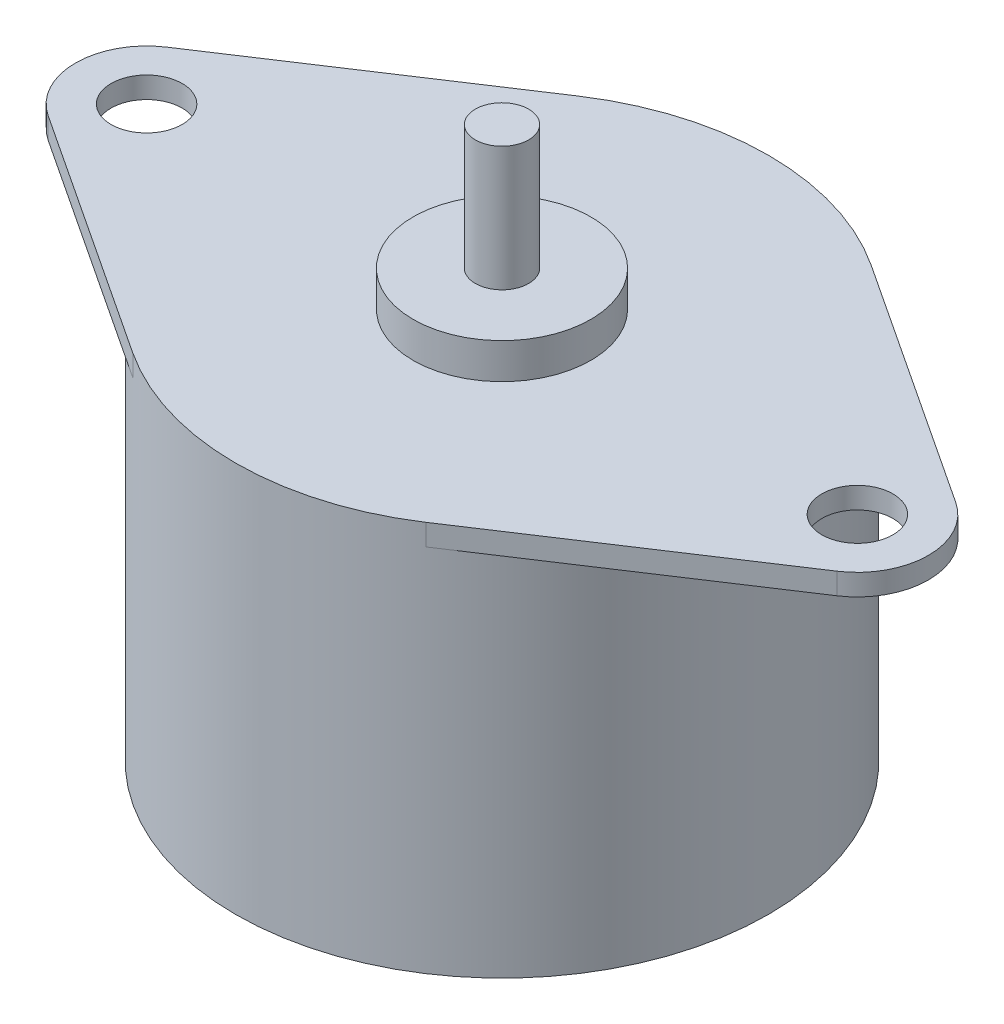
ISO-10303-21;
HEADER;
FILE_DESCRIPTION(('STEP AP214'),'2;1');
FILE_NAME('part.step','',(''),(''),'','','');
FILE_SCHEMA(('AUTOMOTIVE_DESIGN { 1 0 10303 214 1 1 1 1 }'));
ENDSEC;
DATA;
#1=APPLICATION_CONTEXT('core data for automotive mechanical design processes');
#2=APPLICATION_PROTOCOL_DEFINITION('international standard','automotive_design',2000,#1);
#3=PRODUCT_CONTEXT('',#1,'mechanical');
#4=PRODUCT('Part','Part','',(#3));
#5=PRODUCT_RELATED_PRODUCT_CATEGORY('part','',(#4));
#6=PRODUCT_DEFINITION_FORMATION('','',#4);
#7=PRODUCT_DEFINITION_CONTEXT('part definition',#1,'design');
#8=PRODUCT_DEFINITION('design','',#6,#7);
#9=PRODUCT_DEFINITION_SHAPE('','',#8);
#10=(LENGTH_UNIT() NAMED_UNIT(*) SI_UNIT(.MILLI.,.METRE.));
#11=(NAMED_UNIT(*) PLANE_ANGLE_UNIT() SI_UNIT($,.RADIAN.));
#12=(NAMED_UNIT(*) SI_UNIT($,.STERADIAN.) SOLID_ANGLE_UNIT());
#13=UNCERTAINTY_MEASURE_WITH_UNIT(LENGTH_MEASURE(1.E-05),#10,'distance_accuracy_value','');
#14=(GEOMETRIC_REPRESENTATION_CONTEXT(3) GLOBAL_UNCERTAINTY_ASSIGNED_CONTEXT((#13)) GLOBAL_UNIT_ASSIGNED_CONTEXT((#10,
#11,#12)) REPRESENTATION_CONTEXT('',''));
#15=CARTESIAN_POINT('',(0.,0.,0.));
#16=DIRECTION('',(0.,0.,1.));
#17=DIRECTION('',(1.,0.,0.));
#18=AXIS2_PLACEMENT_3D('',#15,#16,#17);
#19=CARTESIAN_POINT('',(0.,-1.,0.));
#20=DIRECTION('',(0.,-1.,0.));
#21=DIRECTION('',(0.,0.,-1.));
#22=AXIS2_PLACEMENT_3D('',#19,#20,#21);
#23=PLANE('',#22);
#24=CARTESIAN_POINT('',(0.,-1.,0.));
#25=DIRECTION('',(0.,-1.,0.));
#26=DIRECTION('',(0.,0.,-1.));
#27=AXIS2_PLACEMENT_3D('',#24,#25,#26);
#28=CIRCLE('',#27,3.);
#29=CARTESIAN_POINT('',(0.,-1.,-3.));
#30=VERTEX_POINT('',#29);
#31=EDGE_CURVE('E127',#30,#30,#28,.T.);
#32=ORIENTED_EDGE('',*,*,#31,.T.);
#33=EDGE_LOOP('',(#32));
#34=FACE_BOUND('',#33,.T.);
#35=CARTESIAN_POINT('',(0.,-1.,0.));
#36=DIRECTION('',(0.,-1.,0.));
#37=DIRECTION('',(0.,0.,-1.));
#38=AXIS2_PLACEMENT_3D('',#35,#36,#37);
#39=CIRCLE('',#38,0.75);
#40=CARTESIAN_POINT('',(0.,-1.,-0.75));
#41=VERTEX_POINT('',#40);
#42=EDGE_CURVE('E222',#41,#41,#39,.T.);
#43=ORIENTED_EDGE('',*,*,#42,.F.);
#44=EDGE_LOOP('',(#43));
#45=FACE_BOUND('',#44,.T.);
#46=ADVANCED_FACE('F35',(#34,#45),#23,.T.);
#47=CARTESIAN_POINT('',(0.,12.,0.));
#48=DIRECTION('',(0.,1.,0.));
#49=DIRECTION('',(0.,0.,1.));
#50=AXIS2_PLACEMENT_3D('',#47,#48,#49);
#51=PLANE('',#50);
#52=CARTESIAN_POINT('',(0.,12.,0.));
#53=DIRECTION('',(0.,1.,0.));
#54=DIRECTION('',(0.,0.,1.));
#55=AXIS2_PLACEMENT_3D('',#52,#53,#54);
#56=CIRCLE('',#55,2.5);
#57=CARTESIAN_POINT('',(0.,12.,2.5));
#58=VERTEX_POINT('',#57);
#59=EDGE_CURVE('E207',#58,#58,#56,.T.);
#60=ORIENTED_EDGE('',*,*,#59,.T.);
#61=EDGE_LOOP('',(#60));
#62=FACE_BOUND('',#61,.T.);
#63=CARTESIAN_POINT('',(0.,12.,0.));
#64=DIRECTION('',(0.,1.,0.));
#65=DIRECTION('',(0.,0.,1.));
#66=AXIS2_PLACEMENT_3D('',#63,#64,#65);
#67=CIRCLE('',#66,0.75);
#68=CARTESIAN_POINT('',(0.,12.,0.75));
#69=VERTEX_POINT('',#68);
#70=EDGE_CURVE('E216',#69,#69,#67,.T.);
#71=ORIENTED_EDGE('',*,*,#70,.F.);
#72=EDGE_LOOP('',(#71));
#73=FACE_BOUND('',#72,.T.);
#74=ADVANCED_FACE('F238',(#62,#73),#51,.T.);
#75=CARTESIAN_POINT('',(-10.,11.,0.));
#76=DIRECTION('',(0.,1.,0.));
#77=DIRECTION('',(0.,0.,1.));
#78=AXIS2_PLACEMENT_3D('',#75,#76,#77);
#79=PLANE('',#78);
#80=CARTESIAN_POINT('',(10.,11.,0.));
#81=DIRECTION('',(0.,1.,0.));
#82=DIRECTION('',(0.,0.,1.));
#83=AXIS2_PLACEMENT_3D('',#80,#81,#82);
#84=CIRCLE('',#83,1.);
#85=CARTESIAN_POINT('',(10.,11.,1.));
#86=VERTEX_POINT('',#85);
#87=EDGE_CURVE('E201',#86,#86,#84,.T.);
#88=ORIENTED_EDGE('',*,*,#87,.F.);
#89=EDGE_LOOP('',(#88));
#90=FACE_BOUND('',#89,.T.);
#91=CARTESIAN_POINT('',(-10.,11.,0.));
#92=DIRECTION('',(0.,1.,0.));
#93=DIRECTION('',(0.,0.,1.));
#94=AXIS2_PLACEMENT_3D('',#91,#92,#93);
#95=CIRCLE('',#94,2.);
#96=CARTESIAN_POINT('',(-11.1,11.,-1.67032930884901));
#97=VERTEX_POINT('',#96);
#98=CARTESIAN_POINT('',(-11.1,11.,1.67032930884901));
#99=VERTEX_POINT('',#98);
#100=EDGE_CURVE('E112',#97,#99,#95,.T.);
#101=ORIENTED_EDGE('',*,*,#100,.T.);
#102=DIRECTION('',(0.835164654424503,0.,0.549999999999999));
#103=VECTOR('',#102,1.);
#104=CARTESIAN_POINT('',(-11.1,11.,1.67032930884901));
#105=LINE('',#104,#103);
#106=CARTESIAN_POINT('',(-4.125,11.,6.26373490818378));
#107=VERTEX_POINT('',#106);
#108=EDGE_CURVE('E102',#99,#107,#105,.T.);
#109=ORIENTED_EDGE('',*,*,#108,.T.);
#110=CARTESIAN_POINT('',(0.,11.,0.));
#111=DIRECTION('',(0.,1.,0.));
#112=DIRECTION('',(0.,0.,-1.));
#113=AXIS2_PLACEMENT_3D('',#110,#111,#112);
#114=CIRCLE('',#113,7.49999999999997);
#115=CARTESIAN_POINT('',(4.12499999999999,11.,6.26373490818378));
#116=VERTEX_POINT('',#115);
#117=EDGE_CURVE('E111',#107,#116,#114,.T.);
#118=ORIENTED_EDGE('',*,*,#117,.T.);
#119=DIRECTION('',(0.835164654424503,0.,-0.55));
#120=VECTOR('',#119,1.);
#121=CARTESIAN_POINT('',(11.1,11.,1.67032930884901));
#122=LINE('',#121,#120);
#123=CARTESIAN_POINT('',(11.1,11.,1.670329308849));
#124=VERTEX_POINT('',#123);
#125=EDGE_CURVE('E195',#116,#124,#122,.T.);
#126=ORIENTED_EDGE('',*,*,#125,.T.);
#127=CARTESIAN_POINT('',(10.,11.,0.));
#128=DIRECTION('',(0.,1.,0.));
#129=DIRECTION('',(0.,0.,-1.));
#130=AXIS2_PLACEMENT_3D('',#127,#128,#129);
#131=CIRCLE('',#130,2.);
#132=CARTESIAN_POINT('',(11.1,11.,-1.670329308849));
#133=VERTEX_POINT('',#132);
#134=EDGE_CURVE('E193',#124,#133,#131,.T.);
#135=ORIENTED_EDGE('',*,*,#134,.T.);
#136=DIRECTION('',(-0.835164654424503,0.,-0.550000000000001));
#137=VECTOR('',#136,1.);
#138=CARTESIAN_POINT('',(4.125,11.,-6.26373490818377));
#139=LINE('',#138,#137);
#140=CARTESIAN_POINT('',(4.125,11.,-6.26373490818377));
#141=VERTEX_POINT('',#140);
#142=EDGE_CURVE('E191',#133,#141,#139,.T.);
#143=ORIENTED_EDGE('',*,*,#142,.T.);
#144=CARTESIAN_POINT('',(0.,11.,0.));
#145=DIRECTION('',(0.,1.,0.));
#146=DIRECTION('',(0.,0.,-1.));
#147=AXIS2_PLACEMENT_3D('',#144,#145,#146);
#148=CIRCLE('',#147,7.5);
#149=CARTESIAN_POINT('',(-4.125,11.,-6.26373490818378));
#150=VERTEX_POINT('',#149);
#151=EDGE_CURVE('E189',#141,#150,#148,.T.);
#152=ORIENTED_EDGE('',*,*,#151,.T.);
#153=DIRECTION('',(-0.835164654424503,0.,0.55));
#154=VECTOR('',#153,1.);
#155=CARTESIAN_POINT('',(-11.1,11.,-1.67032930884901));
#156=LINE('',#155,#154);
#157=EDGE_CURVE('E118',#150,#97,#156,.T.);
#158=ORIENTED_EDGE('',*,*,#157,.T.);
#159=EDGE_LOOP('',(#101,#109,#118,#126,#135,#143,#152,#158));
#160=FACE_BOUND('',#159,.T.);
#161=CARTESIAN_POINT('',(-10.,11.,0.));
#162=DIRECTION('',(0.,1.,0.));
#163=DIRECTION('',(0.,0.,1.));
#164=AXIS2_PLACEMENT_3D('',#161,#162,#163);
#165=CIRCLE('',#164,1.);
#166=CARTESIAN_POINT('',(-10.,11.,1.));
#167=VERTEX_POINT('',#166);
#168=EDGE_CURVE('E187',#167,#167,#165,.T.);
#169=ORIENTED_EDGE('',*,*,#168,.F.);
#170=EDGE_LOOP('',(#169));
#171=FACE_BOUND('',#170,.T.);
#172=CARTESIAN_POINT('',(0.,11.,0.));
#173=DIRECTION('',(0.,1.,0.));
#174=DIRECTION('',(0.,0.,1.));
#175=AXIS2_PLACEMENT_3D('',#172,#173,#174);
#176=CIRCLE('',#175,2.5);
#177=CARTESIAN_POINT('',(0.,11.,2.5));
#178=VERTEX_POINT('',#177);
#179=EDGE_CURVE('E210',#178,#178,#176,.T.);
#180=ORIENTED_EDGE('',*,*,#179,.F.);
#181=EDGE_LOOP('',(#180));
#182=FACE_BOUND('',#181,.T.);
#183=ADVANCED_FACE('F115',(#90,#160,#171,#182),#79,.T.);
#184=CARTESIAN_POINT('',(0.,0.,0.));
#185=DIRECTION('',(0.,1.,0.));
#186=DIRECTION('',(0.,0.,1.));
#187=AXIS2_PLACEMENT_3D('',#184,#185,#186);
#188=PLANE('',#187);
#189=CARTESIAN_POINT('',(0.,0.,0.));
#190=DIRECTION('',(0.,1.,0.));
#191=DIRECTION('',(0.,0.,1.));
#192=AXIS2_PLACEMENT_3D('',#189,#190,#191);
#193=CIRCLE('',#192,7.5);
#194=CARTESIAN_POINT('',(0.,0.,7.5));
#195=VERTEX_POINT('',#194);
#196=EDGE_CURVE('E130',#195,#195,#193,.T.);
#197=ORIENTED_EDGE('',*,*,#196,.F.);
#198=EDGE_LOOP('',(#197));
#199=FACE_BOUND('',#198,.T.);
#200=CARTESIAN_POINT('',(0.,0.,0.));
#201=DIRECTION('',(0.,1.,0.));
#202=DIRECTION('',(0.,0.,1.));
#203=AXIS2_PLACEMENT_3D('',#200,#201,#202);
#204=CIRCLE('',#203,3.);
#205=CARTESIAN_POINT('',(0.,0.,3.));
#206=VERTEX_POINT('',#205);
#207=EDGE_CURVE('E11',#206,#206,#204,.F.);
#208=ORIENTED_EDGE('',*,*,#207,.F.);
#209=EDGE_LOOP('',(#208));
#210=FACE_BOUND('',#209,.T.);
#211=ADVANCED_FACE('F253',(#199,#210),#188,.F.);
#212=CARTESIAN_POINT('',(0.,10.4,0.));
#213=DIRECTION('',(0.,-1.,0.));
#214=DIRECTION('',(0.,0.,-1.));
#215=AXIS2_PLACEMENT_3D('',#212,#213,#214);
#216=CYLINDRICAL_SURFACE('',#215,7.5);
#217=CARTESIAN_POINT('',(0.,10.4,0.));
#218=DIRECTION('',(0.,1.,0.));
#219=DIRECTION('',(0.,0.,1.));
#220=AXIS2_PLACEMENT_3D('',#217,#218,#219);
#221=CIRCLE('',#220,7.5);
#222=CARTESIAN_POINT('',(4.12499999999999,10.4,6.26373490818378));
#223=VERTEX_POINT('',#222);
#224=CARTESIAN_POINT('',(4.12500000000001,10.4,-6.26373490818377));
#225=VERTEX_POINT('',#224);
#226=EDGE_CURVE('E44',#223,#225,#221,.T.);
#227=ORIENTED_EDGE('',*,*,#226,.F.);
#228=DIRECTION('',(0.,-1.,0.));
#229=VECTOR('',#228,1.);
#230=CARTESIAN_POINT('',(4.12499999999999,11.,6.26373490818378));
#231=LINE('',#230,#229);
#232=EDGE_CURVE('E132',#116,#223,#231,.T.);
#233=ORIENTED_EDGE('',*,*,#232,.F.);
#234=ORIENTED_EDGE('',*,*,#117,.F.);
#235=DIRECTION('',(0.,-1.,0.));
#236=VECTOR('',#235,1.);
#237=CARTESIAN_POINT('',(-4.125,11.,6.26373490818378));
#238=LINE('',#237,#236);
#239=CARTESIAN_POINT('',(-4.125,10.4,6.26373490818378));
#240=VERTEX_POINT('',#239);
#241=EDGE_CURVE('E108',#107,#240,#238,.T.);
#242=ORIENTED_EDGE('',*,*,#241,.T.);
#243=CARTESIAN_POINT('',(-4.125,10.4,-6.26373490818378));
#244=VERTEX_POINT('',#243);
#245=EDGE_CURVE('E52',#244,#240,#221,.T.);
#246=ORIENTED_EDGE('',*,*,#245,.F.);
#247=DIRECTION('',(0.,-1.,0.));
#248=VECTOR('',#247,1.);
#249=CARTESIAN_POINT('',(-4.125,11.,-6.26373490818378));
#250=LINE('',#249,#248);
#251=EDGE_CURVE('E160',#150,#244,#250,.T.);
#252=ORIENTED_EDGE('',*,*,#251,.F.);
#253=ORIENTED_EDGE('',*,*,#151,.F.);
#254=DIRECTION('',(0.,-1.,0.));
#255=VECTOR('',#254,1.);
#256=CARTESIAN_POINT('',(4.125,11.,-6.26373490818377));
#257=LINE('',#256,#255);
#258=EDGE_CURVE('E162',#141,#225,#257,.T.);
#259=ORIENTED_EDGE('',*,*,#258,.T.);
#260=EDGE_LOOP('',(#227,#233,#234,#242,#246,#252,#253,#259));
#261=FACE_BOUND('',#260,.T.);
#262=ORIENTED_EDGE('',*,*,#196,.T.);
#263=EDGE_LOOP('',(#262));
#264=FACE_BOUND('',#263,.T.);
#265=ADVANCED_FACE('F37',(#261,#264),#216,.T.);
#266=CARTESIAN_POINT('',(0.,-1.,0.));
#267=DIRECTION('',(0.,1.,0.));
#268=DIRECTION('',(0.,0.,1.));
#269=AXIS2_PLACEMENT_3D('',#266,#267,#268);
#270=CYLINDRICAL_SURFACE('',#269,3.);
#271=ORIENTED_EDGE('',*,*,#31,.F.);
#272=EDGE_LOOP('',(#271));
#273=FACE_BOUND('',#272,.T.);
#274=ORIENTED_EDGE('',*,*,#207,.T.);
#275=EDGE_LOOP('',(#274));
#276=FACE_BOUND('',#275,.T.);
#277=ADVANCED_FACE('F249',(#273,#276),#270,.T.);
#278=CARTESIAN_POINT('',(-10.,10.4,0.));
#279=DIRECTION('',(0.,1.,0.));
#280=DIRECTION('',(0.,0.,1.));
#281=AXIS2_PLACEMENT_3D('',#278,#279,#280);
#282=PLANE('',#281);
#283=CARTESIAN_POINT('',(10.,10.4,0.));
#284=DIRECTION('',(0.,1.,0.));
#285=DIRECTION('',(0.,0.,1.));
#286=AXIS2_PLACEMENT_3D('',#283,#284,#285);
#287=CIRCLE('',#286,1.);
#288=CARTESIAN_POINT('',(10.,10.4,1.));
#289=VERTEX_POINT('',#288);
#290=EDGE_CURVE('E204',#289,#289,#287,.T.);
#291=ORIENTED_EDGE('',*,*,#290,.T.);
#292=EDGE_LOOP('',(#291));
#293=FACE_BOUND('',#292,.T.);
#294=DIRECTION('',(0.835164654424503,0.,-0.55));
#295=VECTOR('',#294,1.);
#296=CARTESIAN_POINT('',(11.1,10.4,1.67032930884901));
#297=LINE('',#296,#295);
#298=CARTESIAN_POINT('',(11.1,10.4,1.670329308849));
#299=VERTEX_POINT('',#298);
#300=EDGE_CURVE('E149',#223,#299,#297,.T.);
#301=ORIENTED_EDGE('',*,*,#300,.F.);
#302=ORIENTED_EDGE('',*,*,#226,.T.);
#303=DIRECTION('',(-0.835164654424503,0.,-0.550000000000001));
#304=VECTOR('',#303,1.);
#305=CARTESIAN_POINT('',(4.125,10.4,-6.26373490818377));
#306=LINE('',#305,#304);
#307=CARTESIAN_POINT('',(11.1,10.4,-1.670329308849));
#308=VERTEX_POINT('',#307);
#309=EDGE_CURVE('E167',#308,#225,#306,.T.);
#310=ORIENTED_EDGE('',*,*,#309,.F.);
#311=CARTESIAN_POINT('',(10.,10.4,0.));
#312=DIRECTION('',(0.,1.,0.));
#313=DIRECTION('',(0.,0.,-1.));
#314=AXIS2_PLACEMENT_3D('',#311,#312,#313);
#315=CIRCLE('',#314,2.);
#316=EDGE_CURVE('E151',#299,#308,#315,.T.);
#317=ORIENTED_EDGE('',*,*,#316,.F.);
#318=EDGE_LOOP('',(#301,#302,#310,#317));
#319=FACE_BOUND('',#318,.T.);
#320=ADVANCED_FACE('F251',(#293,#319),#282,.F.);
#321=CARTESIAN_POINT('',(-10.,10.4,0.));
#322=DIRECTION('',(0.,1.,0.));
#323=DIRECTION('',(0.,0.,1.));
#324=AXIS2_PLACEMENT_3D('',#321,#322,#323);
#325=CIRCLE('',#324,1.);
#326=CARTESIAN_POINT('',(-10.,10.4,1.));
#327=VERTEX_POINT('',#326);
#328=EDGE_CURVE('E198',#327,#327,#325,.T.);
#329=ORIENTED_EDGE('',*,*,#328,.T.);
#330=EDGE_LOOP('',(#329));
#331=FACE_BOUND('',#330,.T.);
#332=DIRECTION('',(-0.835164654424503,0.,0.55));
#333=VECTOR('',#332,1.);
#334=CARTESIAN_POINT('',(-11.1,10.4,-1.67032930884901));
#335=LINE('',#334,#333);
#336=CARTESIAN_POINT('',(-11.1,10.4,-1.67032930884901));
#337=VERTEX_POINT('',#336);
#338=EDGE_CURVE('E122',#244,#337,#335,.T.);
#339=ORIENTED_EDGE('',*,*,#338,.F.);
#340=ORIENTED_EDGE('',*,*,#245,.T.);
#341=DIRECTION('',(0.835164654424503,0.,0.549999999999999));
#342=VECTOR('',#341,1.);
#343=CARTESIAN_POINT('',(-11.1,10.4,1.67032930884901));
#344=LINE('',#343,#342);
#345=CARTESIAN_POINT('',(-11.1,10.4,1.67032930884901));
#346=VERTEX_POINT('',#345);
#347=EDGE_CURVE('E152',#346,#240,#344,.T.);
#348=ORIENTED_EDGE('',*,*,#347,.F.);
#349=CARTESIAN_POINT('',(-10.,10.4,0.));
#350=DIRECTION('',(0.,1.,0.));
#351=DIRECTION('',(0.,0.,1.));
#352=AXIS2_PLACEMENT_3D('',#349,#350,#351);
#353=CIRCLE('',#352,2.);
#354=EDGE_CURVE('E126',#337,#346,#353,.T.);
#355=ORIENTED_EDGE('',*,*,#354,.F.);
#356=EDGE_LOOP('',(#339,#340,#348,#355));
#357=FACE_BOUND('',#356,.T.);
#358=ADVANCED_FACE('F276',(#331,#357),#282,.F.);
#359=CARTESIAN_POINT('',(-10.,11.,0.));
#360=DIRECTION('',(0.,-1.,0.));
#361=DIRECTION('',(0.,0.,-1.));
#362=AXIS2_PLACEMENT_3D('',#359,#360,#361);
#363=CYLINDRICAL_SURFACE('',#362,2.);
#364=ORIENTED_EDGE('',*,*,#354,.T.);
#365=DIRECTION('',(0.,-1.,0.));
#366=VECTOR('',#365,1.);
#367=CARTESIAN_POINT('',(-11.1,11.,1.67032930884901));
#368=LINE('',#367,#366);
#369=EDGE_CURVE('E106',#99,#346,#368,.T.);
#370=ORIENTED_EDGE('',*,*,#369,.F.);
#371=ORIENTED_EDGE('',*,*,#100,.F.);
#372=DIRECTION('',(0.,-1.,0.));
#373=VECTOR('',#372,1.);
#374=CARTESIAN_POINT('',(-11.1,11.,-1.67032930884901));
#375=LINE('',#374,#373);
#376=EDGE_CURVE('E163',#97,#337,#375,.T.);
#377=ORIENTED_EDGE('',*,*,#376,.T.);
#378=EDGE_LOOP('',(#364,#370,#371,#377));
#379=FACE_BOUND('',#378,.T.);
#380=ADVANCED_FACE('F124',(#379),#363,.T.);
#381=CARTESIAN_POINT('',(-11.1,11.,1.67032930884901));
#382=DIRECTION('',(0.55,0.,-0.835164654424504));
#383=DIRECTION('',(-0.835164654424504,0.,-0.55));
#384=AXIS2_PLACEMENT_3D('',#381,#382,#383);
#385=PLANE('',#384);
#386=ORIENTED_EDGE('',*,*,#347,.T.);
#387=ORIENTED_EDGE('',*,*,#241,.F.);
#388=ORIENTED_EDGE('',*,*,#108,.F.);
#389=ORIENTED_EDGE('',*,*,#369,.T.);
#390=EDGE_LOOP('',(#386,#387,#388,#389));
#391=FACE_BOUND('',#390,.T.);
#392=ADVANCED_FACE('F104',(#391),#385,.F.);
#393=CARTESIAN_POINT('',(11.1,11.,1.67032930884901));
#394=DIRECTION('',(-0.55,0.,-0.835164654424503));
#395=DIRECTION('',(-0.835164654424503,0.,0.55));
#396=AXIS2_PLACEMENT_3D('',#393,#394,#395);
#397=PLANE('',#396);
#398=ORIENTED_EDGE('',*,*,#300,.T.);
#399=DIRECTION('',(0.,-1.,0.));
#400=VECTOR('',#399,1.);
#401=CARTESIAN_POINT('',(11.1,11.,1.670329308849));
#402=LINE('',#401,#400);
#403=EDGE_CURVE('E135',#124,#299,#402,.T.);
#404=ORIENTED_EDGE('',*,*,#403,.F.);
#405=ORIENTED_EDGE('',*,*,#125,.F.);
#406=ORIENTED_EDGE('',*,*,#232,.T.);
#407=EDGE_LOOP('',(#398,#404,#405,#406));
#408=FACE_BOUND('',#407,.T.);
#409=ADVANCED_FACE('F288',(#408),#397,.F.);
#410=CARTESIAN_POINT('',(10.,11.,0.));
#411=DIRECTION('',(0.,-1.,0.));
#412=DIRECTION('',(0.,0.,-1.));
#413=AXIS2_PLACEMENT_3D('',#410,#411,#412);
#414=CYLINDRICAL_SURFACE('',#413,2.);
#415=ORIENTED_EDGE('',*,*,#316,.T.);
#416=DIRECTION('',(0.,-1.,0.));
#417=VECTOR('',#416,1.);
#418=CARTESIAN_POINT('',(11.1,11.,-1.670329308849));
#419=LINE('',#418,#417);
#420=EDGE_CURVE('E174',#133,#308,#419,.T.);
#421=ORIENTED_EDGE('',*,*,#420,.F.);
#422=ORIENTED_EDGE('',*,*,#134,.F.);
#423=ORIENTED_EDGE('',*,*,#403,.T.);
#424=EDGE_LOOP('',(#415,#421,#422,#423));
#425=FACE_BOUND('',#424,.T.);
#426=ADVANCED_FACE('F285',(#425),#414,.T.);
#427=CARTESIAN_POINT('',(4.125,11.,-6.26373490818377));
#428=DIRECTION('',(-0.550000000000001,0.,0.835164654424503));
#429=DIRECTION('',(0.835164654424503,0.,0.550000000000001));
#430=AXIS2_PLACEMENT_3D('',#427,#428,#429);
#431=PLANE('',#430);
#432=ORIENTED_EDGE('',*,*,#309,.T.);
#433=ORIENTED_EDGE('',*,*,#258,.F.);
#434=ORIENTED_EDGE('',*,*,#142,.F.);
#435=ORIENTED_EDGE('',*,*,#420,.T.);
#436=EDGE_LOOP('',(#432,#433,#434,#435));
#437=FACE_BOUND('',#436,.T.);
#438=ADVANCED_FACE('F281',(#437),#431,.F.);
#439=CARTESIAN_POINT('',(-11.1,11.,-1.67032930884901));
#440=DIRECTION('',(0.55,0.,0.835164654424503));
#441=DIRECTION('',(0.835164654424504,0.,-0.55));
#442=AXIS2_PLACEMENT_3D('',#439,#440,#441);
#443=PLANE('',#442);
#444=ORIENTED_EDGE('',*,*,#338,.T.);
#445=ORIENTED_EDGE('',*,*,#376,.F.);
#446=ORIENTED_EDGE('',*,*,#157,.F.);
#447=ORIENTED_EDGE('',*,*,#251,.T.);
#448=EDGE_LOOP('',(#444,#445,#446,#447));
#449=FACE_BOUND('',#448,.T.);
#450=ADVANCED_FACE('F278',(#449),#443,.F.);
#451=CARTESIAN_POINT('',(-10.,11.,0.));
#452=DIRECTION('',(0.,-1.,0.));
#453=DIRECTION('',(0.,0.,-1.));
#454=AXIS2_PLACEMENT_3D('',#451,#452,#453);
#455=CYLINDRICAL_SURFACE('',#454,1.);
#456=ORIENTED_EDGE('',*,*,#168,.T.);
#457=EDGE_LOOP('',(#456));
#458=FACE_BOUND('',#457,.T.);
#459=ORIENTED_EDGE('',*,*,#328,.F.);
#460=EDGE_LOOP('',(#459));
#461=FACE_BOUND('',#460,.T.);
#462=ADVANCED_FACE('F272',(#458,#461),#455,.F.);
#463=CARTESIAN_POINT('',(10.,11.,0.));
#464=DIRECTION('',(0.,-1.,0.));
#465=DIRECTION('',(0.,0.,-1.));
#466=AXIS2_PLACEMENT_3D('',#463,#464,#465);
#467=CYLINDRICAL_SURFACE('',#466,1.);
#468=ORIENTED_EDGE('',*,*,#87,.T.);
#469=EDGE_LOOP('',(#468));
#470=FACE_BOUND('',#469,.T.);
#471=ORIENTED_EDGE('',*,*,#290,.F.);
#472=EDGE_LOOP('',(#471));
#473=FACE_BOUND('',#472,.T.);
#474=ADVANCED_FACE('F312',(#470,#473),#467,.F.);
#475=CARTESIAN_POINT('',(0.,12.,0.));
#476=DIRECTION('',(0.,-1.,0.));
#477=DIRECTION('',(0.,0.,-1.));
#478=AXIS2_PLACEMENT_3D('',#475,#476,#477);
#479=CYLINDRICAL_SURFACE('',#478,2.5);
#480=ORIENTED_EDGE('',*,*,#59,.F.);
#481=EDGE_LOOP('',(#480));
#482=FACE_BOUND('',#481,.T.);
#483=ORIENTED_EDGE('',*,*,#179,.T.);
#484=EDGE_LOOP('',(#483));
#485=FACE_BOUND('',#484,.T.);
#486=ADVANCED_FACE('F317',(#482,#485),#479,.T.);
#487=CARTESIAN_POINT('',(0.,15.5,0.));
#488=DIRECTION('',(0.,-1.,0.));
#489=DIRECTION('',(0.,0.,-1.));
#490=AXIS2_PLACEMENT_3D('',#487,#488,#489);
#491=CYLINDRICAL_SURFACE('',#490,0.75);
#492=CARTESIAN_POINT('',(0.,15.5,0.));
#493=DIRECTION('',(0.,1.,0.));
#494=DIRECTION('',(0.,0.,1.));
#495=AXIS2_PLACEMENT_3D('',#492,#493,#494);
#496=CIRCLE('',#495,0.75);
#497=CARTESIAN_POINT('',(0.,15.5,0.75));
#498=VERTEX_POINT('',#497);
#499=EDGE_CURVE('E213',#498,#498,#496,.T.);
#500=ORIENTED_EDGE('',*,*,#499,.F.);
#501=EDGE_LOOP('',(#500));
#502=FACE_BOUND('',#501,.T.);
#503=ORIENTED_EDGE('',*,*,#70,.T.);
#504=EDGE_LOOP('',(#503));
#505=FACE_BOUND('',#504,.T.);
#506=ADVANCED_FACE('F324',(#502,#505),#491,.T.);
#507=CARTESIAN_POINT('',(0.,15.5,0.));
#508=DIRECTION('',(0.,1.,0.));
#509=DIRECTION('',(0.,0.,1.));
#510=AXIS2_PLACEMENT_3D('',#507,#508,#509);
#511=PLANE('',#510);
#512=ORIENTED_EDGE('',*,*,#499,.T.);
#513=EDGE_LOOP('',(#512));
#514=FACE_BOUND('',#513,.T.);
#515=ADVANCED_FACE('F233',(#514),#511,.T.);
#516=CARTESIAN_POINT('',(0.,-2.,0.));
#517=DIRECTION('',(0.,1.,0.));
#518=DIRECTION('',(0.,0.,1.));
#519=AXIS2_PLACEMENT_3D('',#516,#517,#518);
#520=CYLINDRICAL_SURFACE('',#519,0.75);
#521=CARTESIAN_POINT('',(0.,-2.,0.));
#522=DIRECTION('',(0.,-1.,0.));
#523=DIRECTION('',(0.,0.,-1.));
#524=AXIS2_PLACEMENT_3D('',#521,#522,#523);
#525=CIRCLE('',#524,0.75);
#526=CARTESIAN_POINT('',(0.,-2.,-0.75));
#527=VERTEX_POINT('',#526);
#528=EDGE_CURVE('E219',#527,#527,#525,.T.);
#529=ORIENTED_EDGE('',*,*,#528,.F.);
#530=EDGE_LOOP('',(#529));
#531=FACE_BOUND('',#530,.T.);
#532=ORIENTED_EDGE('',*,*,#42,.T.);
#533=EDGE_LOOP('',(#532));
#534=FACE_BOUND('',#533,.T.);
#535=ADVANCED_FACE('F230',(#531,#534),#520,.T.);
#536=CARTESIAN_POINT('',(0.,-2.,0.));
#537=DIRECTION('',(0.,-1.,0.));
#538=DIRECTION('',(0.,0.,-1.));
#539=AXIS2_PLACEMENT_3D('',#536,#537,#538);
#540=PLANE('',#539);
#541=ORIENTED_EDGE('',*,*,#528,.T.);
#542=EDGE_LOOP('',(#541));
#543=FACE_BOUND('',#542,.T.);
#544=ADVANCED_FACE('F228',(#543),#540,.T.);
#545=CLOSED_SHELL('',(#46,#74,#183,#211,#265,#277,#320,#358,#380,#392,#409,#426,#438,#450,#462,
#474,#486,#506,#515,#535,#544));
#546=MANIFOLD_SOLID_BREP('B2',#545);
#547=ADVANCED_BREP_SHAPE_REPRESENTATION('',(#18,#546),#14);
#548=SHAPE_DEFINITION_REPRESENTATION(#9,#547);
ENDSEC;
END-ISO-10303-21;
